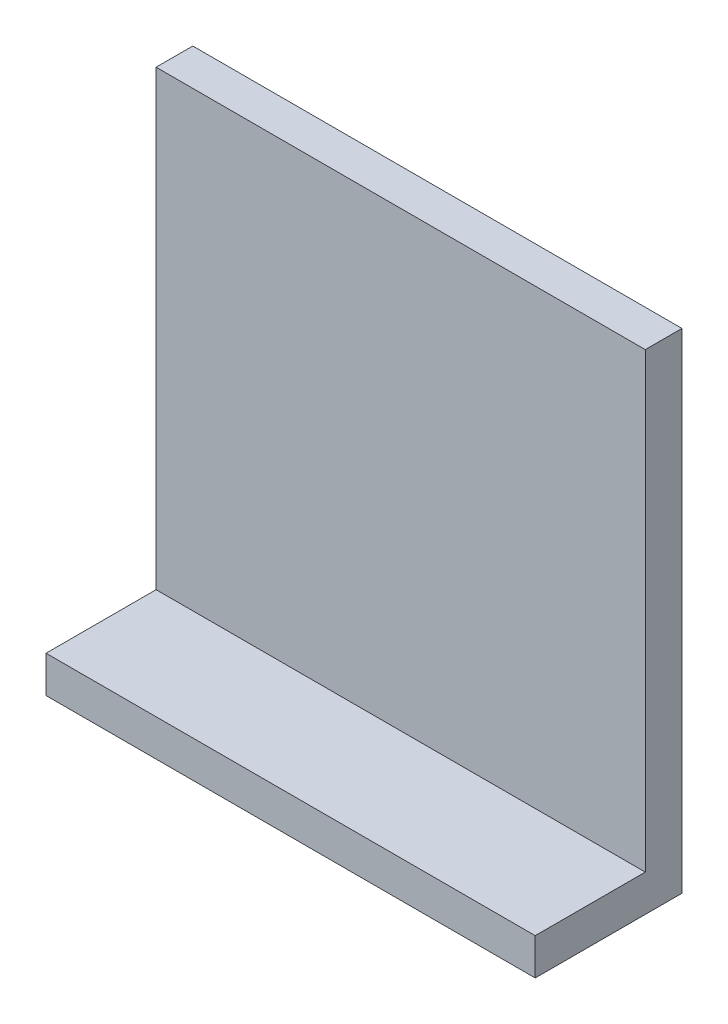
ISO-10303-21;
HEADER;
FILE_DESCRIPTION(('STEP AP214'),'2;1');
FILE_NAME('part.step','',(''),(''),'','','');
FILE_SCHEMA(('AUTOMOTIVE_DESIGN { 1 0 10303 214 1 1 1 1 }'));
ENDSEC;
DATA;
#1=APPLICATION_CONTEXT('core data for automotive mechanical design processes');
#2=APPLICATION_PROTOCOL_DEFINITION('international standard','automotive_design',2000,#1);
#3=PRODUCT_CONTEXT('',#1,'mechanical');
#4=PRODUCT('Part','Part','',(#3));
#5=PRODUCT_RELATED_PRODUCT_CATEGORY('part','',(#4));
#6=PRODUCT_DEFINITION_FORMATION('','',#4);
#7=PRODUCT_DEFINITION_CONTEXT('part definition',#1,'design');
#8=PRODUCT_DEFINITION('design','',#6,#7);
#9=PRODUCT_DEFINITION_SHAPE('','',#8);
#10=(LENGTH_UNIT() NAMED_UNIT(*) SI_UNIT(.MILLI.,.METRE.));
#11=(NAMED_UNIT(*) PLANE_ANGLE_UNIT() SI_UNIT($,.RADIAN.));
#12=(NAMED_UNIT(*) SI_UNIT($,.STERADIAN.) SOLID_ANGLE_UNIT());
#13=UNCERTAINTY_MEASURE_WITH_UNIT(LENGTH_MEASURE(1.E-05),#10,'distance_accuracy_value','');
#14=(GEOMETRIC_REPRESENTATION_CONTEXT(3) GLOBAL_UNCERTAINTY_ASSIGNED_CONTEXT((#13)) GLOBAL_UNIT_ASSIGNED_CONTEXT((#10,
#11,#12)) REPRESENTATION_CONTEXT('',''));
#15=CARTESIAN_POINT('',(0.,0.,0.));
#16=DIRECTION('',(0.,0.,1.));
#17=DIRECTION('',(1.,0.,0.));
#18=AXIS2_PLACEMENT_3D('',#15,#16,#17);
#19=CARTESIAN_POINT('',(0.,0.,6.));
#20=DIRECTION('',(1.,0.,0.));
#21=DIRECTION('',(0.,1.,0.));
#22=AXIS2_PLACEMENT_3D('',#19,#20,#21);
#23=PLANE('',#22);
#24=DIRECTION('',(0.,0.,-1.));
#25=VECTOR('',#24,1.);
#26=CARTESIAN_POINT('',(0.,1.49999999999999,6.));
#27=LINE('',#26,#25);
#28=CARTESIAN_POINT('',(0.,1.49999999999997,6.));
#29=VERTEX_POINT('',#28);
#30=CARTESIAN_POINT('',(0.,1.49999999999997,1.5));
#31=VERTEX_POINT('',#30);
#32=EDGE_CURVE('E53',#29,#31,#27,.T.);
#33=ORIENTED_EDGE('',*,*,#32,.T.);
#34=DIRECTION('',(0.,1.,0.));
#35=VECTOR('',#34,1.);
#36=CARTESIAN_POINT('',(0.,20.,1.5));
#37=LINE('',#36,#35);
#38=CARTESIAN_POINT('',(0.,20.,1.5));
#39=VERTEX_POINT('',#38);
#40=EDGE_CURVE('E88',#31,#39,#37,.T.);
#41=ORIENTED_EDGE('',*,*,#40,.T.);
#42=DIRECTION('',(0.,0.,-1.));
#43=VECTOR('',#42,1.);
#44=CARTESIAN_POINT('',(0.,20.,6.));
#45=LINE('',#44,#43);
#46=CARTESIAN_POINT('',(0.,20.,0.));
#47=VERTEX_POINT('',#46);
#48=EDGE_CURVE('E82',#39,#47,#45,.T.);
#49=ORIENTED_EDGE('',*,*,#48,.T.);
#50=DIRECTION('',(0.,-1.,0.));
#51=VECTOR('',#50,1.);
#52=CARTESIAN_POINT('',(0.,0.,0.));
#53=LINE('',#52,#51);
#54=CARTESIAN_POINT('',(0.,0.,0.));
#55=VERTEX_POINT('',#54);
#56=EDGE_CURVE('E86',#47,#55,#53,.T.);
#57=ORIENTED_EDGE('',*,*,#56,.T.);
#58=DIRECTION('',(0.,0.,-1.));
#59=VECTOR('',#58,1.);
#60=CARTESIAN_POINT('',(0.,0.,6.));
#61=LINE('',#60,#59);
#62=CARTESIAN_POINT('',(0.,0.,6.));
#63=VERTEX_POINT('',#62);
#64=EDGE_CURVE('E11',#63,#55,#61,.T.);
#65=ORIENTED_EDGE('',*,*,#64,.F.);
#66=DIRECTION('',(0.,-1.,0.));
#67=VECTOR('',#66,1.);
#68=CARTESIAN_POINT('',(0.,0.,6.));
#69=LINE('',#68,#67);
#70=EDGE_CURVE('E101',#29,#63,#69,.T.);
#71=ORIENTED_EDGE('',*,*,#70,.F.);
#72=EDGE_LOOP('',(#33,#41,#49,#57,#65,#71));
#73=FACE_BOUND('',#72,.T.);
#74=ADVANCED_FACE('F39',(#73),#23,.F.);
#75=CARTESIAN_POINT('',(0.,0.,6.));
#76=DIRECTION('',(0.,1.,0.));
#77=DIRECTION('',(0.,0.,1.));
#78=AXIS2_PLACEMENT_3D('',#75,#76,#77);
#79=PLANE('',#78);
#80=DIRECTION('',(1.,0.,0.));
#81=VECTOR('',#80,1.);
#82=CARTESIAN_POINT('',(0.,0.,0.));
#83=LINE('',#82,#81);
#84=CARTESIAN_POINT('',(20.,0.,0.));
#85=VERTEX_POINT('',#84);
#86=EDGE_CURVE('E105',#55,#85,#83,.T.);
#87=ORIENTED_EDGE('',*,*,#86,.T.);
#88=DIRECTION('',(0.,0.,-1.));
#89=VECTOR('',#88,1.);
#90=CARTESIAN_POINT('',(20.,0.,6.));
#91=LINE('',#90,#89);
#92=CARTESIAN_POINT('',(20.,0.,6.));
#93=VERTEX_POINT('',#92);
#94=EDGE_CURVE('E46',#93,#85,#91,.T.);
#95=ORIENTED_EDGE('',*,*,#94,.F.);
#96=DIRECTION('',(1.,0.,0.));
#97=VECTOR('',#96,1.);
#98=CARTESIAN_POINT('',(0.,0.,6.));
#99=LINE('',#98,#97);
#100=EDGE_CURVE('E62',#63,#93,#99,.T.);
#101=ORIENTED_EDGE('',*,*,#100,.F.);
#102=ORIENTED_EDGE('',*,*,#64,.T.);
#103=EDGE_LOOP('',(#87,#95,#101,#102));
#104=FACE_BOUND('',#103,.T.);
#105=ADVANCED_FACE('F121',(#104),#79,.F.);
#106=CARTESIAN_POINT('',(20.,0.,6.));
#107=DIRECTION('',(-1.,0.,0.));
#108=DIRECTION('',(0.,-1.,0.));
#109=AXIS2_PLACEMENT_3D('',#106,#107,#108);
#110=PLANE('',#109);
#111=DIRECTION('',(0.,0.,-1.));
#112=VECTOR('',#111,1.);
#113=CARTESIAN_POINT('',(20.,20.,6.));
#114=LINE('',#113,#112);
#115=CARTESIAN_POINT('',(20.,20.,1.5));
#116=VERTEX_POINT('',#115);
#117=CARTESIAN_POINT('',(20.,20.,0.));
#118=VERTEX_POINT('',#117);
#119=EDGE_CURVE('E91',#116,#118,#114,.T.);
#120=ORIENTED_EDGE('',*,*,#119,.F.);
#121=DIRECTION('',(0.,1.,0.));
#122=VECTOR('',#121,1.);
#123=CARTESIAN_POINT('',(20.,20.,1.5));
#124=LINE('',#123,#122);
#125=CARTESIAN_POINT('',(20.,1.49999999999998,1.5));
#126=VERTEX_POINT('',#125);
#127=EDGE_CURVE('E130',#126,#116,#124,.T.);
#128=ORIENTED_EDGE('',*,*,#127,.F.);
#129=DIRECTION('',(0.,0.,-1.));
#130=VECTOR('',#129,1.);
#131=CARTESIAN_POINT('',(20.,1.5,6.));
#132=LINE('',#131,#130);
#133=CARTESIAN_POINT('',(20.,1.5,6.));
#134=VERTEX_POINT('',#133);
#135=EDGE_CURVE('E133',#134,#126,#132,.T.);
#136=ORIENTED_EDGE('',*,*,#135,.F.);
#137=DIRECTION('',(0.,1.,0.));
#138=VECTOR('',#137,1.);
#139=CARTESIAN_POINT('',(20.,0.,6.));
#140=LINE('',#139,#138);
#141=EDGE_CURVE('E92',#93,#134,#140,.T.);
#142=ORIENTED_EDGE('',*,*,#141,.F.);
#143=ORIENTED_EDGE('',*,*,#94,.T.);
#144=DIRECTION('',(0.,1.,0.));
#145=VECTOR('',#144,1.);
#146=CARTESIAN_POINT('',(20.,0.,0.));
#147=LINE('',#146,#145);
#148=EDGE_CURVE('E102',#85,#118,#147,.T.);
#149=ORIENTED_EDGE('',*,*,#148,.T.);
#150=EDGE_LOOP('',(#120,#128,#136,#142,#143,#149));
#151=FACE_BOUND('',#150,.T.);
#152=ADVANCED_FACE('F118',(#151),#110,.F.);
#153=CARTESIAN_POINT('',(0.,20.,6.));
#154=DIRECTION('',(0.,-1.,0.));
#155=DIRECTION('',(0.,0.,-1.));
#156=AXIS2_PLACEMENT_3D('',#153,#154,#155);
#157=PLANE('',#156);
#158=ORIENTED_EDGE('',*,*,#48,.F.);
#159=DIRECTION('',(1.,0.,0.));
#160=VECTOR('',#159,1.);
#161=CARTESIAN_POINT('',(0.,20.,1.5));
#162=LINE('',#161,#160);
#163=EDGE_CURVE('E106',#39,#116,#162,.T.);
#164=ORIENTED_EDGE('',*,*,#163,.T.);
#165=ORIENTED_EDGE('',*,*,#119,.T.);
#166=DIRECTION('',(-1.,0.,0.));
#167=VECTOR('',#166,1.);
#168=CARTESIAN_POINT('',(0.,20.,0.));
#169=LINE('',#168,#167);
#170=EDGE_CURVE('E95',#118,#47,#169,.T.);
#171=ORIENTED_EDGE('',*,*,#170,.T.);
#172=EDGE_LOOP('',(#158,#164,#165,#171));
#173=FACE_BOUND('',#172,.T.);
#174=ADVANCED_FACE('F96',(#173),#157,.F.);
#175=CARTESIAN_POINT('',(0.,0.,6.));
#176=DIRECTION('',(0.,0.,-1.));
#177=DIRECTION('',(-1.,0.,0.));
#178=AXIS2_PLACEMENT_3D('',#175,#176,#177);
#179=PLANE('',#178);
#180=ORIENTED_EDGE('',*,*,#141,.T.);
#181=DIRECTION('',(1.,0.,0.));
#182=VECTOR('',#181,1.);
#183=CARTESIAN_POINT('',(0.,1.49999999999999,6.));
#184=LINE('',#183,#182);
#185=EDGE_CURVE('E126',#29,#134,#184,.T.);
#186=ORIENTED_EDGE('',*,*,#185,.F.);
#187=ORIENTED_EDGE('',*,*,#70,.T.);
#188=ORIENTED_EDGE('',*,*,#100,.T.);
#189=EDGE_LOOP('',(#180,#186,#187,#188));
#190=FACE_BOUND('',#189,.T.);
#191=ADVANCED_FACE('F156',(#190),#179,.F.);
#192=CARTESIAN_POINT('',(0.,0.,0.));
#193=DIRECTION('',(0.,0.,-1.));
#194=DIRECTION('',(-1.,0.,0.));
#195=AXIS2_PLACEMENT_3D('',#192,#193,#194);
#196=PLANE('',#195);
#197=ORIENTED_EDGE('',*,*,#56,.F.);
#198=ORIENTED_EDGE('',*,*,#170,.F.);
#199=ORIENTED_EDGE('',*,*,#148,.F.);
#200=ORIENTED_EDGE('',*,*,#86,.F.);
#201=EDGE_LOOP('',(#197,#198,#199,#200));
#202=FACE_BOUND('',#201,.T.);
#203=ADVANCED_FACE('F104',(#202),#196,.T.);
#204=CARTESIAN_POINT('',(0.,20.,1.5));
#205=DIRECTION('',(0.,0.,-1.));
#206=DIRECTION('',(0.,1.,0.));
#207=AXIS2_PLACEMENT_3D('',#204,#205,#206);
#208=PLANE('',#207);
#209=ORIENTED_EDGE('',*,*,#127,.T.);
#210=ORIENTED_EDGE('',*,*,#163,.F.);
#211=ORIENTED_EDGE('',*,*,#40,.F.);
#212=DIRECTION('',(1.,0.,0.));
#213=VECTOR('',#212,1.);
#214=CARTESIAN_POINT('',(0.,1.49999999999997,1.5));
#215=LINE('',#214,#213);
#216=EDGE_CURVE('E109',#31,#126,#215,.T.);
#217=ORIENTED_EDGE('',*,*,#216,.T.);
#218=EDGE_LOOP('',(#209,#210,#211,#217));
#219=FACE_BOUND('',#218,.T.);
#220=ADVANCED_FACE('F145',(#219),#208,.F.);
#221=CARTESIAN_POINT('',(0.,1.49999999999999,6.));
#222=DIRECTION('',(0.,-1.,0.));
#223=DIRECTION('',(0.,0.,-1.));
#224=AXIS2_PLACEMENT_3D('',#221,#222,#223);
#225=PLANE('',#224);
#226=ORIENTED_EDGE('',*,*,#135,.T.);
#227=ORIENTED_EDGE('',*,*,#216,.F.);
#228=ORIENTED_EDGE('',*,*,#32,.F.);
#229=ORIENTED_EDGE('',*,*,#185,.T.);
#230=EDGE_LOOP('',(#226,#227,#228,#229));
#231=FACE_BOUND('',#230,.T.);
#232=ADVANCED_FACE('F139',(#231),#225,.F.);
#233=CLOSED_SHELL('',(#74,#105,#152,#174,#191,#203,#220,#232));
#234=MANIFOLD_SOLID_BREP('B2',#233);
#235=ADVANCED_BREP_SHAPE_REPRESENTATION('',(#18,#234),#14);
#236=SHAPE_DEFINITION_REPRESENTATION(#9,#235);
ENDSEC;
END-ISO-10303-21;
